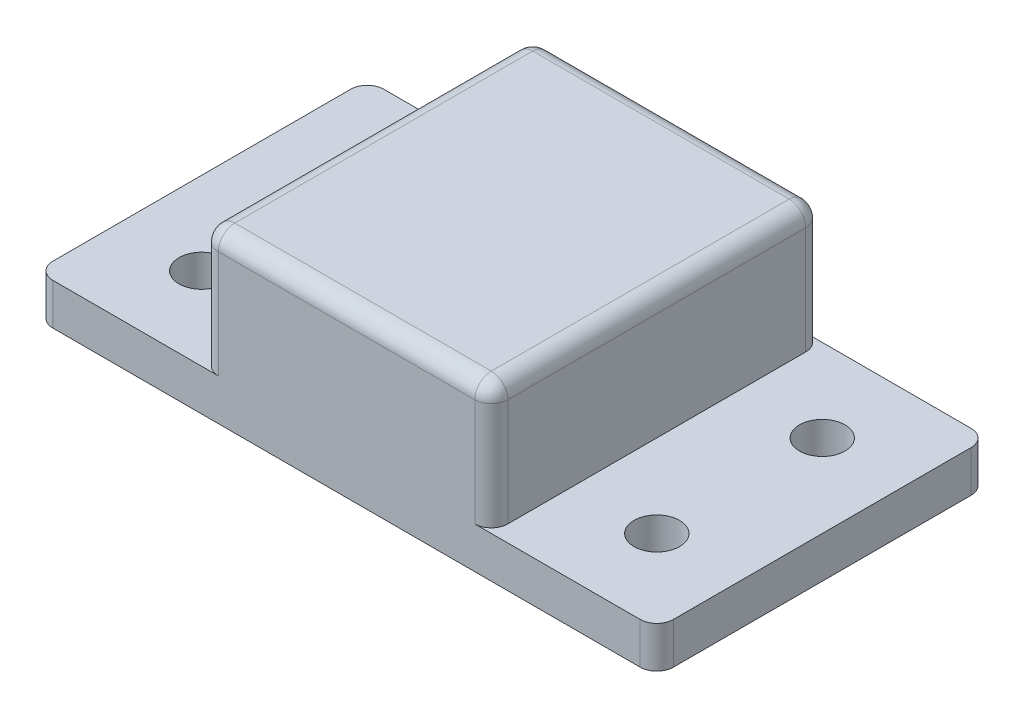
ISO-10303-21;
HEADER;
FILE_DESCRIPTION(('STEP AP214'),'2;1');
FILE_NAME('part.step','',(''),(''),'','','');
FILE_SCHEMA(('AUTOMOTIVE_DESIGN { 1 0 10303 214 1 1 1 1 }'));
ENDSEC;
DATA;
#1=APPLICATION_CONTEXT('core data for automotive mechanical design processes');
#2=APPLICATION_PROTOCOL_DEFINITION('international standard','automotive_design',2000,#1);
#3=PRODUCT_CONTEXT('',#1,'mechanical');
#4=PRODUCT('Part','Part','',(#3));
#5=PRODUCT_RELATED_PRODUCT_CATEGORY('part','',(#4));
#6=PRODUCT_DEFINITION_FORMATION('','',#4);
#7=PRODUCT_DEFINITION_CONTEXT('part definition',#1,'design');
#8=PRODUCT_DEFINITION('design','',#6,#7);
#9=PRODUCT_DEFINITION_SHAPE('','',#8);
#10=(LENGTH_UNIT() NAMED_UNIT(*) SI_UNIT(.MILLI.,.METRE.));
#11=(NAMED_UNIT(*) PLANE_ANGLE_UNIT() SI_UNIT($,.RADIAN.));
#12=(NAMED_UNIT(*) SI_UNIT($,.STERADIAN.) SOLID_ANGLE_UNIT());
#13=UNCERTAINTY_MEASURE_WITH_UNIT(LENGTH_MEASURE(1.E-05),#10,'distance_accuracy_value','');
#14=(GEOMETRIC_REPRESENTATION_CONTEXT(3) GLOBAL_UNCERTAINTY_ASSIGNED_CONTEXT((#13)) GLOBAL_UNIT_ASSIGNED_CONTEXT((#10,
#11,#12)) REPRESENTATION_CONTEXT('',''));
#15=CARTESIAN_POINT('',(0.,0.,0.));
#16=DIRECTION('',(0.,0.,1.));
#17=DIRECTION('',(1.,0.,0.));
#18=AXIS2_PLACEMENT_3D('',#15,#16,#17);
#19=CARTESIAN_POINT('',(0.,5.,0.));
#20=DIRECTION('',(0.,-1.,0.));
#21=DIRECTION('',(0.,0.,-1.));
#22=AXIS2_PLACEMENT_3D('',#19,#20,#21);
#23=PLANE('',#22);
#24=CARTESIAN_POINT('',(27.5,5.,10.));
#25=DIRECTION('',(0.,-1.,0.));
#26=DIRECTION('',(0.,0.,-1.));
#27=AXIS2_PLACEMENT_3D('',#24,#25,#26);
#28=CIRCLE('',#27,2.75);
#29=CARTESIAN_POINT('',(27.5,5.,7.25));
#30=VERTEX_POINT('',#29);
#31=EDGE_CURVE('E43',#30,#30,#28,.T.);
#32=ORIENTED_EDGE('',*,*,#31,.T.);
#33=EDGE_LOOP('',(#32));
#34=FACE_BOUND('',#33,.T.);
#35=CARTESIAN_POINT('',(27.5,5.,-10.));
#36=DIRECTION('',(0.,-1.,0.));
#37=DIRECTION('',(0.,0.,-1.));
#38=AXIS2_PLACEMENT_3D('',#35,#36,#37);
#39=CIRCLE('',#38,2.75);
#40=CARTESIAN_POINT('',(27.5,5.,-12.75));
#41=VERTEX_POINT('',#40);
#42=EDGE_CURVE('E381',#41,#41,#39,.T.);
#43=ORIENTED_EDGE('',*,*,#42,.T.);
#44=EDGE_LOOP('',(#43));
#45=FACE_BOUND('',#44,.T.);
#46=DIRECTION('',(1.,0.,0.));
#47=VECTOR('',#46,1.);
#48=CARTESIAN_POINT('',(-37.5,5.,20.));
#49=LINE('',#48,#47);
#50=CARTESIAN_POINT('',(15.5,5.,20.));
#51=VERTEX_POINT('',#50);
#52=CARTESIAN_POINT('',(35.5,5.,20.));
#53=VERTEX_POINT('',#52);
#54=EDGE_CURVE('E420',#51,#53,#49,.T.);
#55=ORIENTED_EDGE('',*,*,#54,.T.);
#56=CARTESIAN_POINT('',(35.5,5.,18.));
#57=DIRECTION('',(0.,-1.,0.));
#58=DIRECTION('',(0.,0.,-1.));
#59=AXIS2_PLACEMENT_3D('',#56,#57,#58);
#60=CIRCLE('',#59,2.);
#61=CARTESIAN_POINT('',(37.5,5.,18.));
#62=VERTEX_POINT('',#61);
#63=EDGE_CURVE('E245',#53,#62,#60,.F.);
#64=ORIENTED_EDGE('',*,*,#63,.T.);
#65=DIRECTION('',(0.,0.,1.));
#66=VECTOR('',#65,1.);
#67=CARTESIAN_POINT('',(37.5,5.,-20.));
#68=LINE('',#67,#66);
#69=CARTESIAN_POINT('',(37.5,5.,-18.));
#70=VERTEX_POINT('',#69);
#71=EDGE_CURVE('E417',#70,#62,#68,.T.);
#72=ORIENTED_EDGE('',*,*,#71,.F.);
#73=CARTESIAN_POINT('',(35.5,5.,-18.));
#74=DIRECTION('',(0.,-1.,0.));
#75=DIRECTION('',(0.,0.,-1.));
#76=AXIS2_PLACEMENT_3D('',#73,#74,#75);
#77=CIRCLE('',#76,2.);
#78=CARTESIAN_POINT('',(35.5,5.,-20.));
#79=VERTEX_POINT('',#78);
#80=EDGE_CURVE('E220',#70,#79,#77,.F.);
#81=ORIENTED_EDGE('',*,*,#80,.T.);
#82=DIRECTION('',(1.,0.,0.));
#83=VECTOR('',#82,1.);
#84=CARTESIAN_POINT('',(-37.5,5.,-20.));
#85=LINE('',#84,#83);
#86=CARTESIAN_POINT('',(15.5,5.,-20.));
#87=VERTEX_POINT('',#86);
#88=EDGE_CURVE('E418',#87,#79,#85,.T.);
#89=ORIENTED_EDGE('',*,*,#88,.F.);
#90=CARTESIAN_POINT('',(15.5,5.,-18.));
#91=DIRECTION('',(0.,-1.,0.));
#92=DIRECTION('',(0.,0.,-1.));
#93=AXIS2_PLACEMENT_3D('',#90,#91,#92);
#94=CIRCLE('',#93,2.);
#95=CARTESIAN_POINT('',(17.5,5.,-18.));
#96=VERTEX_POINT('',#95);
#97=EDGE_CURVE('E315',#87,#96,#94,.T.);
#98=ORIENTED_EDGE('',*,*,#97,.T.);
#99=DIRECTION('',(0.,0.,-1.));
#100=VECTOR('',#99,1.);
#101=CARTESIAN_POINT('',(17.5,5.,-20.));
#102=LINE('',#101,#100);
#103=CARTESIAN_POINT('',(17.5,5.,18.));
#104=VERTEX_POINT('',#103);
#105=EDGE_CURVE('E371',#104,#96,#102,.T.);
#106=ORIENTED_EDGE('',*,*,#105,.F.);
#107=CARTESIAN_POINT('',(15.5,5.,18.));
#108=DIRECTION('',(0.,-1.,0.));
#109=DIRECTION('',(0.,0.,-1.));
#110=AXIS2_PLACEMENT_3D('',#107,#108,#109);
#111=CIRCLE('',#110,2.);
#112=EDGE_CURVE('E11',#104,#51,#111,.T.);
#113=ORIENTED_EDGE('',*,*,#112,.T.);
#114=EDGE_LOOP('',(#55,#64,#72,#81,#89,#98,#106,#113));
#115=FACE_BOUND('',#114,.T.);
#116=ADVANCED_FACE('F39',(#34,#45,#115),#23,.F.);
#117=CARTESIAN_POINT('',(-27.5,5.,10.));
#118=DIRECTION('',(0.,-1.,0.));
#119=DIRECTION('',(0.,0.,-1.));
#120=AXIS2_PLACEMENT_3D('',#117,#118,#119);
#121=CIRCLE('',#120,2.75);
#122=CARTESIAN_POINT('',(-27.5,5.,7.25));
#123=VERTEX_POINT('',#122);
#124=EDGE_CURVE('E376',#123,#123,#121,.T.);
#125=ORIENTED_EDGE('',*,*,#124,.T.);
#126=EDGE_LOOP('',(#125));
#127=FACE_BOUND('',#126,.T.);
#128=CARTESIAN_POINT('',(-27.5,5.,-10.));
#129=DIRECTION('',(0.,-1.,0.));
#130=DIRECTION('',(0.,0.,-1.));
#131=AXIS2_PLACEMENT_3D('',#128,#129,#130);
#132=CIRCLE('',#131,2.75);
#133=CARTESIAN_POINT('',(-27.5,5.,-12.75));
#134=VERTEX_POINT('',#133);
#135=EDGE_CURVE('E328',#134,#134,#132,.T.);
#136=ORIENTED_EDGE('',*,*,#135,.T.);
#137=EDGE_LOOP('',(#136));
#138=FACE_BOUND('',#137,.T.);
#139=DIRECTION('',(0.,0.,1.));
#140=VECTOR('',#139,1.);
#141=CARTESIAN_POINT('',(-37.5,5.,-20.));
#142=LINE('',#141,#140);
#143=CARTESIAN_POINT('',(-37.5,5.,-18.));
#144=VERTEX_POINT('',#143);
#145=CARTESIAN_POINT('',(-37.5,5.,18.));
#146=VERTEX_POINT('',#145);
#147=EDGE_CURVE('E221',#144,#146,#142,.T.);
#148=ORIENTED_EDGE('',*,*,#147,.T.);
#149=CARTESIAN_POINT('',(-35.5,5.,18.));
#150=DIRECTION('',(0.,-1.,0.));
#151=DIRECTION('',(0.,0.,-1.));
#152=AXIS2_PLACEMENT_3D('',#149,#150,#151);
#153=CIRCLE('',#152,2.);
#154=CARTESIAN_POINT('',(-35.5,5.,20.));
#155=VERTEX_POINT('',#154);
#156=EDGE_CURVE('E262',#146,#155,#153,.F.);
#157=ORIENTED_EDGE('',*,*,#156,.T.);
#158=CARTESIAN_POINT('',(-15.5,5.,20.));
#159=VERTEX_POINT('',#158);
#160=EDGE_CURVE('E227',#155,#159,#49,.T.);
#161=ORIENTED_EDGE('',*,*,#160,.T.);
#162=CARTESIAN_POINT('',(-15.5,5.,18.));
#163=DIRECTION('',(0.,-1.,0.));
#164=DIRECTION('',(0.,0.,-1.));
#165=AXIS2_PLACEMENT_3D('',#162,#163,#164);
#166=CIRCLE('',#165,2.);
#167=CARTESIAN_POINT('',(-17.5,5.,18.));
#168=VERTEX_POINT('',#167);
#169=EDGE_CURVE('E49',#159,#168,#166,.T.);
#170=ORIENTED_EDGE('',*,*,#169,.T.);
#171=DIRECTION('',(0.,0.,1.));
#172=VECTOR('',#171,1.);
#173=CARTESIAN_POINT('',(-17.5,5.,-20.));
#174=LINE('',#173,#172);
#175=CARTESIAN_POINT('',(-17.5,5.,-18.));
#176=VERTEX_POINT('',#175);
#177=EDGE_CURVE('E410',#176,#168,#174,.T.);
#178=ORIENTED_EDGE('',*,*,#177,.F.);
#179=CARTESIAN_POINT('',(-15.5,5.,-18.));
#180=DIRECTION('',(0.,-1.,0.));
#181=DIRECTION('',(0.,0.,-1.));
#182=AXIS2_PLACEMENT_3D('',#179,#180,#181);
#183=CIRCLE('',#182,2.);
#184=CARTESIAN_POINT('',(-15.5,5.,-20.));
#185=VERTEX_POINT('',#184);
#186=EDGE_CURVE('E318',#176,#185,#183,.T.);
#187=ORIENTED_EDGE('',*,*,#186,.T.);
#188=CARTESIAN_POINT('',(-35.5,5.,-20.));
#189=VERTEX_POINT('',#188);
#190=EDGE_CURVE('E414',#189,#185,#85,.T.);
#191=ORIENTED_EDGE('',*,*,#190,.F.);
#192=CARTESIAN_POINT('',(-35.5,5.,-18.));
#193=DIRECTION('',(0.,-1.,0.));
#194=DIRECTION('',(0.,0.,-1.));
#195=AXIS2_PLACEMENT_3D('',#192,#193,#194);
#196=CIRCLE('',#195,2.);
#197=EDGE_CURVE('E259',#189,#144,#196,.F.);
#198=ORIENTED_EDGE('',*,*,#197,.T.);
#199=EDGE_LOOP('',(#148,#157,#161,#170,#178,#187,#191,#198));
#200=FACE_BOUND('',#199,.T.);
#201=ADVANCED_FACE('F456',(#127,#138,#200),#23,.F.);
#202=CARTESIAN_POINT('',(-37.5,5.,-20.));
#203=DIRECTION('',(0.,0.,-1.));
#204=DIRECTION('',(-1.,0.,0.));
#205=AXIS2_PLACEMENT_3D('',#202,#203,#204);
#206=PLANE('',#205);
#207=DIRECTION('',(0.,-1.,0.));
#208=VECTOR('',#207,1.);
#209=CARTESIAN_POINT('',(15.5,5.,-20.));
#210=LINE('',#209,#208);
#211=CARTESIAN_POINT('',(15.5,18.,-20.));
#212=VERTEX_POINT('',#211);
#213=EDGE_CURVE('E304',#212,#87,#210,.T.);
#214=ORIENTED_EDGE('',*,*,#213,.T.);
#215=ORIENTED_EDGE('',*,*,#88,.T.);
#216=DIRECTION('',(0.,-1.,0.));
#217=VECTOR('',#216,1.);
#218=CARTESIAN_POINT('',(35.5,5.,-20.));
#219=LINE('',#218,#217);
#220=CARTESIAN_POINT('',(35.5,0.,-20.));
#221=VERTEX_POINT('',#220);
#222=EDGE_CURVE('E250',#79,#221,#219,.T.);
#223=ORIENTED_EDGE('',*,*,#222,.T.);
#224=DIRECTION('',(1.,0.,0.));
#225=VECTOR('',#224,1.);
#226=CARTESIAN_POINT('',(-37.5,0.,-20.));
#227=LINE('',#226,#225);
#228=CARTESIAN_POINT('',(-35.5,0.,-20.));
#229=VERTEX_POINT('',#228);
#230=EDGE_CURVE('E200',#229,#221,#227,.T.);
#231=ORIENTED_EDGE('',*,*,#230,.F.);
#232=DIRECTION('',(0.,-1.,0.));
#233=VECTOR('',#232,1.);
#234=CARTESIAN_POINT('',(-35.5,5.,-20.));
#235=LINE('',#234,#233);
#236=EDGE_CURVE('E247',#229,#189,#235,.F.);
#237=ORIENTED_EDGE('',*,*,#236,.T.);
#238=ORIENTED_EDGE('',*,*,#190,.T.);
#239=DIRECTION('',(0.,-1.,0.));
#240=VECTOR('',#239,1.);
#241=CARTESIAN_POINT('',(-15.5,20.,-20.));
#242=LINE('',#241,#240);
#243=CARTESIAN_POINT('',(-15.5,18.,-20.));
#244=VERTEX_POINT('',#243);
#245=EDGE_CURVE('E298',#185,#244,#242,.F.);
#246=ORIENTED_EDGE('',*,*,#245,.T.);
#247=DIRECTION('',(-1.,0.,0.));
#248=VECTOR('',#247,1.);
#249=CARTESIAN_POINT('',(-37.5,18.,-20.));
#250=LINE('',#249,#248);
#251=EDGE_CURVE('E301',#244,#212,#250,.F.);
#252=ORIENTED_EDGE('',*,*,#251,.T.);
#253=EDGE_LOOP('',(#214,#215,#223,#231,#237,#238,#246,#252));
#254=FACE_BOUND('',#253,.T.);
#255=ADVANCED_FACE('F438',(#254),#206,.T.);
#256=CARTESIAN_POINT('',(-37.5,5.,-20.));
#257=DIRECTION('',(1.,0.,0.));
#258=DIRECTION('',(0.,0.,-1.));
#259=AXIS2_PLACEMENT_3D('',#256,#257,#258);
#260=PLANE('',#259);
#261=DIRECTION('',(0.,0.,1.));
#262=VECTOR('',#261,1.);
#263=CARTESIAN_POINT('',(-37.5,0.,-20.));
#264=LINE('',#263,#262);
#265=CARTESIAN_POINT('',(-37.5,0.,-18.));
#266=VERTEX_POINT('',#265);
#267=CARTESIAN_POINT('',(-37.5,0.,18.));
#268=VERTEX_POINT('',#267);
#269=EDGE_CURVE('E230',#266,#268,#264,.T.);
#270=ORIENTED_EDGE('',*,*,#269,.T.);
#271=DIRECTION('',(0.,-1.,0.));
#272=VECTOR('',#271,1.);
#273=CARTESIAN_POINT('',(-37.5,5.,18.));
#274=LINE('',#273,#272);
#275=EDGE_CURVE('E256',#268,#146,#274,.F.);
#276=ORIENTED_EDGE('',*,*,#275,.T.);
#277=ORIENTED_EDGE('',*,*,#147,.F.);
#278=DIRECTION('',(0.,-1.,0.));
#279=VECTOR('',#278,1.);
#280=CARTESIAN_POINT('',(-37.5,0.,-18.));
#281=LINE('',#280,#279);
#282=EDGE_CURVE('E252',#144,#266,#281,.T.);
#283=ORIENTED_EDGE('',*,*,#282,.T.);
#284=EDGE_LOOP('',(#270,#276,#277,#283));
#285=FACE_BOUND('',#284,.T.);
#286=ADVANCED_FACE('F462',(#285),#260,.F.);
#287=CARTESIAN_POINT('',(-37.5,5.,20.));
#288=DIRECTION('',(0.,0.,-1.));
#289=DIRECTION('',(-1.,0.,0.));
#290=AXIS2_PLACEMENT_3D('',#287,#288,#289);
#291=PLANE('',#290);
#292=DIRECTION('',(0.,-1.,0.));
#293=VECTOR('',#292,1.);
#294=CARTESIAN_POINT('',(-15.5,5.,20.));
#295=LINE('',#294,#293);
#296=CARTESIAN_POINT('',(-15.5,18.,20.));
#297=VERTEX_POINT('',#296);
#298=EDGE_CURVE('E285',#297,#159,#295,.T.);
#299=ORIENTED_EDGE('',*,*,#298,.T.);
#300=ORIENTED_EDGE('',*,*,#160,.F.);
#301=DIRECTION('',(0.,-1.,0.));
#302=VECTOR('',#301,1.);
#303=CARTESIAN_POINT('',(-35.5,5.,20.));
#304=LINE('',#303,#302);
#305=CARTESIAN_POINT('',(-35.5,0.,20.));
#306=VERTEX_POINT('',#305);
#307=EDGE_CURVE('E238',#155,#306,#304,.T.);
#308=ORIENTED_EDGE('',*,*,#307,.T.);
#309=DIRECTION('',(1.,0.,0.));
#310=VECTOR('',#309,1.);
#311=CARTESIAN_POINT('',(-37.5,0.,20.));
#312=LINE('',#311,#310);
#313=CARTESIAN_POINT('',(35.5,0.,20.));
#314=VERTEX_POINT('',#313);
#315=EDGE_CURVE('E216',#306,#314,#312,.T.);
#316=ORIENTED_EDGE('',*,*,#315,.T.);
#317=DIRECTION('',(0.,-1.,0.));
#318=VECTOR('',#317,1.);
#319=CARTESIAN_POINT('',(35.5,5.,20.));
#320=LINE('',#319,#318);
#321=EDGE_CURVE('E242',#314,#53,#320,.F.);
#322=ORIENTED_EDGE('',*,*,#321,.T.);
#323=ORIENTED_EDGE('',*,*,#54,.F.);
#324=DIRECTION('',(0.,-1.,0.));
#325=VECTOR('',#324,1.);
#326=CARTESIAN_POINT('',(15.5,5.,20.));
#327=LINE('',#326,#325);
#328=CARTESIAN_POINT('',(15.5,18.,20.));
#329=VERTEX_POINT('',#328);
#330=EDGE_CURVE('E278',#51,#329,#327,.F.);
#331=ORIENTED_EDGE('',*,*,#330,.T.);
#332=DIRECTION('',(1.,0.,0.));
#333=VECTOR('',#332,1.);
#334=CARTESIAN_POINT('',(-17.5,18.,20.));
#335=LINE('',#334,#333);
#336=EDGE_CURVE('E281',#329,#297,#335,.F.);
#337=ORIENTED_EDGE('',*,*,#336,.T.);
#338=EDGE_LOOP('',(#299,#300,#308,#316,#322,#323,#331,#337));
#339=FACE_BOUND('',#338,.T.);
#340=ADVANCED_FACE('F452',(#339),#291,.F.);
#341=CARTESIAN_POINT('',(37.5,5.,-20.));
#342=DIRECTION('',(1.,0.,0.));
#343=DIRECTION('',(0.,0.,-1.));
#344=AXIS2_PLACEMENT_3D('',#341,#342,#343);
#345=PLANE('',#344);
#346=ORIENTED_EDGE('',*,*,#71,.T.);
#347=DIRECTION('',(0.,-1.,0.));
#348=VECTOR('',#347,1.);
#349=CARTESIAN_POINT('',(37.5,0.,18.));
#350=LINE('',#349,#348);
#351=CARTESIAN_POINT('',(37.5,0.,18.));
#352=VERTEX_POINT('',#351);
#353=EDGE_CURVE('E215',#62,#352,#350,.T.);
#354=ORIENTED_EDGE('',*,*,#353,.T.);
#355=DIRECTION('',(0.,0.,1.));
#356=VECTOR('',#355,1.);
#357=CARTESIAN_POINT('',(37.5,0.,-20.));
#358=LINE('',#357,#356);
#359=CARTESIAN_POINT('',(37.5,0.,-18.));
#360=VERTEX_POINT('',#359);
#361=EDGE_CURVE('E198',#360,#352,#358,.T.);
#362=ORIENTED_EDGE('',*,*,#361,.F.);
#363=DIRECTION('',(0.,-1.,0.));
#364=VECTOR('',#363,1.);
#365=CARTESIAN_POINT('',(37.5,5.,-18.));
#366=LINE('',#365,#364);
#367=EDGE_CURVE('E212',#360,#70,#366,.F.);
#368=ORIENTED_EDGE('',*,*,#367,.T.);
#369=EDGE_LOOP('',(#346,#354,#362,#368));
#370=FACE_BOUND('',#369,.T.);
#371=ADVANCED_FACE('F211',(#370),#345,.T.);
#372=CARTESIAN_POINT('',(0.,0.,0.));
#373=DIRECTION('',(0.,-1.,0.));
#374=DIRECTION('',(0.,0.,-1.));
#375=AXIS2_PLACEMENT_3D('',#372,#373,#374);
#376=PLANE('',#375);
#377=CARTESIAN_POINT('',(27.5,0.,10.));
#378=DIRECTION('',(0.,-1.,0.));
#379=DIRECTION('',(0.,0.,-1.));
#380=AXIS2_PLACEMENT_3D('',#377,#378,#379);
#381=CIRCLE('',#380,2.775);
#382=CARTESIAN_POINT('',(27.5,0.,7.225));
#383=VERTEX_POINT('',#382);
#384=EDGE_CURVE('E822',#383,#383,#381,.T.);
#385=ORIENTED_EDGE('',*,*,#384,.F.);
#386=EDGE_LOOP('',(#385));
#387=FACE_BOUND('',#386,.T.);
#388=CARTESIAN_POINT('',(27.5,0.,-10.));
#389=DIRECTION('',(0.,-1.,0.));
#390=DIRECTION('',(0.,0.,-1.));
#391=AXIS2_PLACEMENT_3D('',#388,#389,#390);
#392=CIRCLE('',#391,2.775);
#393=CARTESIAN_POINT('',(27.5,0.,-12.775));
#394=VERTEX_POINT('',#393);
#395=EDGE_CURVE('E391',#394,#394,#392,.T.);
#396=ORIENTED_EDGE('',*,*,#395,.F.);
#397=EDGE_LOOP('',(#396));
#398=FACE_BOUND('',#397,.T.);
#399=CARTESIAN_POINT('',(-27.5,0.,10.));
#400=DIRECTION('',(0.,-1.,0.));
#401=DIRECTION('',(0.,0.,-1.));
#402=AXIS2_PLACEMENT_3D('',#399,#400,#401);
#403=CIRCLE('',#402,2.775);
#404=CARTESIAN_POINT('',(-27.5,0.,7.225));
#405=VERTEX_POINT('',#404);
#406=EDGE_CURVE('E383',#405,#405,#403,.T.);
#407=ORIENTED_EDGE('',*,*,#406,.F.);
#408=EDGE_LOOP('',(#407));
#409=FACE_BOUND('',#408,.T.);
#410=CARTESIAN_POINT('',(-27.5,0.,-10.));
#411=DIRECTION('',(0.,-1.,0.));
#412=DIRECTION('',(0.,0.,-1.));
#413=AXIS2_PLACEMENT_3D('',#410,#411,#412);
#414=CIRCLE('',#413,2.775);
#415=CARTESIAN_POINT('',(-27.5,0.,-12.775));
#416=VERTEX_POINT('',#415);
#417=EDGE_CURVE('E379',#416,#416,#414,.T.);
#418=ORIENTED_EDGE('',*,*,#417,.F.);
#419=EDGE_LOOP('',(#418));
#420=FACE_BOUND('',#419,.T.);
#421=ORIENTED_EDGE('',*,*,#361,.T.);
#422=CARTESIAN_POINT('',(35.5,0.,18.));
#423=DIRECTION('',(0.,-1.,0.));
#424=DIRECTION('',(0.,0.,-1.));
#425=AXIS2_PLACEMENT_3D('',#422,#423,#424);
#426=CIRCLE('',#425,2.);
#427=EDGE_CURVE('E205',#352,#314,#426,.T.);
#428=ORIENTED_EDGE('',*,*,#427,.T.);
#429=ORIENTED_EDGE('',*,*,#315,.F.);
#430=CARTESIAN_POINT('',(-35.5,0.,18.));
#431=DIRECTION('',(0.,-1.,0.));
#432=DIRECTION('',(0.,0.,-1.));
#433=AXIS2_PLACEMENT_3D('',#430,#431,#432);
#434=CIRCLE('',#433,2.);
#435=EDGE_CURVE('E206',#306,#268,#434,.T.);
#436=ORIENTED_EDGE('',*,*,#435,.T.);
#437=ORIENTED_EDGE('',*,*,#269,.F.);
#438=CARTESIAN_POINT('',(-35.5,0.,-18.));
#439=DIRECTION('',(0.,-1.,0.));
#440=DIRECTION('',(0.,0.,-1.));
#441=AXIS2_PLACEMENT_3D('',#438,#439,#440);
#442=CIRCLE('',#441,2.);
#443=EDGE_CURVE('E223',#266,#229,#442,.T.);
#444=ORIENTED_EDGE('',*,*,#443,.T.);
#445=ORIENTED_EDGE('',*,*,#230,.T.);
#446=CARTESIAN_POINT('',(35.5,0.,-18.));
#447=DIRECTION('',(0.,-1.,0.));
#448=DIRECTION('',(0.,0.,-1.));
#449=AXIS2_PLACEMENT_3D('',#446,#447,#448);
#450=CIRCLE('',#449,2.);
#451=EDGE_CURVE('E195',#221,#360,#450,.T.);
#452=ORIENTED_EDGE('',*,*,#451,.T.);
#453=EDGE_LOOP('',(#421,#428,#429,#436,#437,#444,#445,#452));
#454=FACE_BOUND('',#453,.T.);
#455=ADVANCED_FACE('F197',(#387,#398,#409,#420,#454),#376,.T.);
#456=CARTESIAN_POINT('',(17.5,20.,-20.));
#457=DIRECTION('',(-1.,0.,0.));
#458=DIRECTION('',(0.,0.,1.));
#459=AXIS2_PLACEMENT_3D('',#456,#457,#458);
#460=PLANE('',#459);
#461=ORIENTED_EDGE('',*,*,#105,.T.);
#462=DIRECTION('',(0.,-1.,0.));
#463=VECTOR('',#462,1.);
#464=CARTESIAN_POINT('',(17.5,20.,-18.));
#465=LINE('',#464,#463);
#466=CARTESIAN_POINT('',(17.5,18.,-18.));
#467=VERTEX_POINT('',#466);
#468=EDGE_CURVE('E60',#96,#467,#465,.F.);
#469=ORIENTED_EDGE('',*,*,#468,.T.);
#470=DIRECTION('',(0.,0.,-1.));
#471=VECTOR('',#470,1.);
#472=CARTESIAN_POINT('',(17.5,18.,20.));
#473=LINE('',#472,#471);
#474=CARTESIAN_POINT('',(17.5,18.,18.));
#475=VERTEX_POINT('',#474);
#476=EDGE_CURVE('E68',#467,#475,#473,.F.);
#477=ORIENTED_EDGE('',*,*,#476,.T.);
#478=DIRECTION('',(0.,-1.,0.));
#479=VECTOR('',#478,1.);
#480=CARTESIAN_POINT('',(17.5,20.,18.));
#481=LINE('',#480,#479);
#482=EDGE_CURVE('E308',#475,#104,#481,.T.);
#483=ORIENTED_EDGE('',*,*,#482,.T.);
#484=EDGE_LOOP('',(#461,#469,#477,#483));
#485=FACE_BOUND('',#484,.T.);
#486=ADVANCED_FACE('F502',(#485),#460,.F.);
#487=CARTESIAN_POINT('',(-17.5,20.,-20.));
#488=DIRECTION('',(1.,0.,0.));
#489=DIRECTION('',(0.,0.,-1.));
#490=AXIS2_PLACEMENT_3D('',#487,#488,#489);
#491=PLANE('',#490);
#492=DIRECTION('',(0.,0.,1.));
#493=VECTOR('',#492,1.);
#494=CARTESIAN_POINT('',(-17.5,18.,-20.));
#495=LINE('',#494,#493);
#496=CARTESIAN_POINT('',(-17.5,18.,18.));
#497=VERTEX_POINT('',#496);
#498=CARTESIAN_POINT('',(-17.5,18.,-18.));
#499=VERTEX_POINT('',#498);
#500=EDGE_CURVE('E292',#497,#499,#495,.F.);
#501=ORIENTED_EDGE('',*,*,#500,.T.);
#502=DIRECTION('',(0.,-1.,0.));
#503=VECTOR('',#502,1.);
#504=CARTESIAN_POINT('',(-17.5,5.,-18.));
#505=LINE('',#504,#503);
#506=EDGE_CURVE('E295',#499,#176,#505,.T.);
#507=ORIENTED_EDGE('',*,*,#506,.T.);
#508=ORIENTED_EDGE('',*,*,#177,.T.);
#509=DIRECTION('',(0.,-1.,0.));
#510=VECTOR('',#509,1.);
#511=CARTESIAN_POINT('',(-17.5,20.,18.));
#512=LINE('',#511,#510);
#513=EDGE_CURVE('E289',#168,#497,#512,.F.);
#514=ORIENTED_EDGE('',*,*,#513,.T.);
#515=EDGE_LOOP('',(#501,#507,#508,#514));
#516=FACE_BOUND('',#515,.T.);
#517=ADVANCED_FACE('F731',(#516),#491,.F.);
#518=CARTESIAN_POINT('',(0.,20.,0.));
#519=DIRECTION('',(0.,1.,0.));
#520=DIRECTION('',(0.,0.,1.));
#521=AXIS2_PLACEMENT_3D('',#518,#519,#520);
#522=PLANE('',#521);
#523=DIRECTION('',(0.,0.,1.));
#524=VECTOR('',#523,1.);
#525=CARTESIAN_POINT('',(-15.5,20.,20.));
#526=LINE('',#525,#524);
#527=CARTESIAN_POINT('',(-15.5,20.,-18.));
#528=VERTEX_POINT('',#527);
#529=CARTESIAN_POINT('',(-15.5,20.,18.));
#530=VERTEX_POINT('',#529);
#531=EDGE_CURVE('E271',#528,#530,#526,.T.);
#532=ORIENTED_EDGE('',*,*,#531,.T.);
#533=DIRECTION('',(1.,0.,0.));
#534=VECTOR('',#533,1.);
#535=CARTESIAN_POINT('',(17.5,20.,18.));
#536=LINE('',#535,#534);
#537=CARTESIAN_POINT('',(15.5,20.,18.));
#538=VERTEX_POINT('',#537);
#539=EDGE_CURVE('E274',#530,#538,#536,.T.);
#540=ORIENTED_EDGE('',*,*,#539,.T.);
#541=DIRECTION('',(0.,0.,-1.));
#542=VECTOR('',#541,1.);
#543=CARTESIAN_POINT('',(15.5,20.,-20.));
#544=LINE('',#543,#542);
#545=CARTESIAN_POINT('',(15.5,20.,-18.));
#546=VERTEX_POINT('',#545);
#547=EDGE_CURVE('E265',#538,#546,#544,.T.);
#548=ORIENTED_EDGE('',*,*,#547,.T.);
#549=DIRECTION('',(-1.,0.,0.));
#550=VECTOR('',#549,1.);
#551=CARTESIAN_POINT('',(0.,20.,-18.));
#552=LINE('',#551,#550);
#553=EDGE_CURVE('E268',#546,#528,#552,.T.);
#554=ORIENTED_EDGE('',*,*,#553,.T.);
#555=EDGE_LOOP('',(#532,#540,#548,#554));
#556=FACE_BOUND('',#555,.T.);
#557=ADVANCED_FACE('F517',(#556),#522,.T.);
#558=CARTESIAN_POINT('',(35.5,5.,18.));
#559=DIRECTION('',(0.,1.,0.));
#560=DIRECTION('',(0.,0.,1.));
#561=AXIS2_PLACEMENT_3D('',#558,#559,#560);
#562=CYLINDRICAL_SURFACE('',#561,2.);
#563=ORIENTED_EDGE('',*,*,#63,.F.);
#564=ORIENTED_EDGE('',*,*,#321,.F.);
#565=ORIENTED_EDGE('',*,*,#427,.F.);
#566=ORIENTED_EDGE('',*,*,#353,.F.);
#567=EDGE_LOOP('',(#563,#564,#565,#566));
#568=FACE_BOUND('',#567,.T.);
#569=ADVANCED_FACE('F446',(#568),#562,.T.);
#570=CARTESIAN_POINT('',(35.5,5.,-18.));
#571=DIRECTION('',(0.,-1.,0.));
#572=DIRECTION('',(0.,0.,-1.));
#573=AXIS2_PLACEMENT_3D('',#570,#571,#572);
#574=CYLINDRICAL_SURFACE('',#573,2.);
#575=ORIENTED_EDGE('',*,*,#80,.F.);
#576=ORIENTED_EDGE('',*,*,#367,.F.);
#577=ORIENTED_EDGE('',*,*,#451,.F.);
#578=ORIENTED_EDGE('',*,*,#222,.F.);
#579=EDGE_LOOP('',(#575,#576,#577,#578));
#580=FACE_BOUND('',#579,.T.);
#581=ADVANCED_FACE('F219',(#580),#574,.T.);
#582=CARTESIAN_POINT('',(-35.5,5.,18.));
#583=DIRECTION('',(0.,-1.,0.));
#584=DIRECTION('',(0.,0.,-1.));
#585=AXIS2_PLACEMENT_3D('',#582,#583,#584);
#586=CYLINDRICAL_SURFACE('',#585,2.);
#587=ORIENTED_EDGE('',*,*,#156,.F.);
#588=ORIENTED_EDGE('',*,*,#275,.F.);
#589=ORIENTED_EDGE('',*,*,#435,.F.);
#590=ORIENTED_EDGE('',*,*,#307,.F.);
#591=EDGE_LOOP('',(#587,#588,#589,#590));
#592=FACE_BOUND('',#591,.T.);
#593=ADVANCED_FACE('F450',(#592),#586,.T.);
#594=CARTESIAN_POINT('',(-35.5,5.,-18.));
#595=DIRECTION('',(0.,1.,0.));
#596=DIRECTION('',(0.,0.,1.));
#597=AXIS2_PLACEMENT_3D('',#594,#595,#596);
#598=CYLINDRICAL_SURFACE('',#597,2.);
#599=ORIENTED_EDGE('',*,*,#197,.F.);
#600=ORIENTED_EDGE('',*,*,#236,.F.);
#601=ORIENTED_EDGE('',*,*,#443,.F.);
#602=ORIENTED_EDGE('',*,*,#282,.F.);
#603=EDGE_LOOP('',(#599,#600,#601,#602));
#604=FACE_BOUND('',#603,.T.);
#605=ADVANCED_FACE('F464',(#604),#598,.T.);
#606=CARTESIAN_POINT('',(-15.5,20.,-18.));
#607=DIRECTION('',(0.,1.,0.));
#608=DIRECTION('',(0.,0.,1.));
#609=AXIS2_PLACEMENT_3D('',#606,#607,#608);
#610=CYLINDRICAL_SURFACE('',#609,2.);
#611=ORIENTED_EDGE('',*,*,#186,.F.);
#612=ORIENTED_EDGE('',*,*,#506,.F.);
#613=CARTESIAN_POINT('',(-15.5,18.,-18.));
#614=DIRECTION('',(0.,1.,0.));
#615=DIRECTION('',(0.,0.,1.));
#616=AXIS2_PLACEMENT_3D('',#613,#614,#615);
#617=CIRCLE('',#616,2.);
#618=EDGE_CURVE('E367',#244,#499,#617,.T.);
#619=ORIENTED_EDGE('',*,*,#618,.F.);
#620=ORIENTED_EDGE('',*,*,#245,.F.);
#621=EDGE_LOOP('',(#611,#612,#619,#620));
#622=FACE_BOUND('',#621,.T.);
#623=ADVANCED_FACE('F41',(#622),#610,.T.);
#624=CARTESIAN_POINT('',(0.,18.,-18.));
#625=DIRECTION('',(-1.,0.,0.));
#626=DIRECTION('',(0.,0.,1.));
#627=AXIS2_PLACEMENT_3D('',#624,#625,#626);
#628=CYLINDRICAL_SURFACE('',#627,2.);
#629=CARTESIAN_POINT('',(15.5,18.,-18.));
#630=DIRECTION('',(1.,0.,0.));
#631=DIRECTION('',(0.,1.,0.));
#632=AXIS2_PLACEMENT_3D('',#629,#630,#631);
#633=CIRCLE('',#632,2.);
#634=EDGE_CURVE('E359',#212,#546,#633,.T.);
#635=ORIENTED_EDGE('',*,*,#634,.F.);
#636=ORIENTED_EDGE('',*,*,#251,.F.);
#637=CARTESIAN_POINT('',(-15.5,18.,-18.));
#638=DIRECTION('',(-1.,0.,0.));
#639=DIRECTION('',(0.,0.,1.));
#640=AXIS2_PLACEMENT_3D('',#637,#638,#639);
#641=CIRCLE('',#640,2.);
#642=EDGE_CURVE('E363',#528,#244,#641,.T.);
#643=ORIENTED_EDGE('',*,*,#642,.F.);
#644=ORIENTED_EDGE('',*,*,#553,.F.);
#645=EDGE_LOOP('',(#635,#636,#643,#644));
#646=FACE_BOUND('',#645,.T.);
#647=ADVANCED_FACE('F475',(#646),#628,.T.);
#648=CARTESIAN_POINT('',(15.5,5.,-18.));
#649=DIRECTION('',(0.,1.,0.));
#650=DIRECTION('',(0.,0.,1.));
#651=AXIS2_PLACEMENT_3D('',#648,#649,#650);
#652=CYLINDRICAL_SURFACE('',#651,2.);
#653=ORIENTED_EDGE('',*,*,#97,.F.);
#654=ORIENTED_EDGE('',*,*,#213,.F.);
#655=CARTESIAN_POINT('',(15.5,18.,-18.));
#656=DIRECTION('',(0.,1.,0.));
#657=DIRECTION('',(0.,0.,1.));
#658=AXIS2_PLACEMENT_3D('',#655,#656,#657);
#659=CIRCLE('',#658,2.);
#660=EDGE_CURVE('E355',#467,#212,#659,.T.);
#661=ORIENTED_EDGE('',*,*,#660,.F.);
#662=ORIENTED_EDGE('',*,*,#468,.F.);
#663=EDGE_LOOP('',(#653,#654,#661,#662));
#664=FACE_BOUND('',#663,.T.);
#665=ADVANCED_FACE('F482',(#664),#652,.T.);
#666=CARTESIAN_POINT('',(-15.5,18.,-18.));
#667=DIRECTION('',(0.,0.,-1.));
#668=DIRECTION('',(-1.,0.,0.));
#669=AXIS2_PLACEMENT_3D('',#666,#667,#668);
#670=SPHERICAL_SURFACE('',#669,2.);
#671=ORIENTED_EDGE('',*,*,#642,.T.);
#672=ORIENTED_EDGE('',*,*,#618,.T.);
#673=CARTESIAN_POINT('',(-15.5,18.,-18.));
#674=DIRECTION('',(0.,0.,-1.));
#675=DIRECTION('',(-1.,0.,0.));
#676=AXIS2_PLACEMENT_3D('',#673,#674,#675);
#677=CIRCLE('',#676,2.);
#678=EDGE_CURVE('E351',#528,#499,#677,.F.);
#679=ORIENTED_EDGE('',*,*,#678,.F.);
#680=EDGE_LOOP('',(#671,#672,#679));
#681=FACE_BOUND('',#680,.T.);
#682=ADVANCED_FACE('F484',(#681),#670,.T.);
#683=CARTESIAN_POINT('',(15.5,18.,-18.));
#684=DIRECTION('',(0.,0.,-1.));
#685=DIRECTION('',(-1.,0.,0.));
#686=AXIS2_PLACEMENT_3D('',#683,#684,#685);
#687=SPHERICAL_SURFACE('',#686,2.);
#688=ORIENTED_EDGE('',*,*,#660,.T.);
#689=ORIENTED_EDGE('',*,*,#634,.T.);
#690=CARTESIAN_POINT('',(15.5,18.,-18.));
#691=DIRECTION('',(0.,0.,-1.));
#692=DIRECTION('',(-1.,0.,0.));
#693=AXIS2_PLACEMENT_3D('',#690,#691,#692);
#694=CIRCLE('',#693,2.);
#695=EDGE_CURVE('E347',#467,#546,#694,.F.);
#696=ORIENTED_EDGE('',*,*,#695,.F.);
#697=EDGE_LOOP('',(#688,#689,#696));
#698=FACE_BOUND('',#697,.T.);
#699=ADVANCED_FACE('F480',(#698),#687,.T.);
#700=CARTESIAN_POINT('',(-15.5,5.,18.));
#701=DIRECTION('',(0.,-1.,0.));
#702=DIRECTION('',(0.,0.,-1.));
#703=AXIS2_PLACEMENT_3D('',#700,#701,#702);
#704=CYLINDRICAL_SURFACE('',#703,2.);
#705=ORIENTED_EDGE('',*,*,#169,.F.);
#706=ORIENTED_EDGE('',*,*,#298,.F.);
#707=CARTESIAN_POINT('',(-15.5,18.,18.));
#708=DIRECTION('',(0.,1.,0.));
#709=DIRECTION('',(0.,0.,1.));
#710=AXIS2_PLACEMENT_3D('',#707,#708,#709);
#711=CIRCLE('',#710,2.);
#712=EDGE_CURVE('E343',#497,#297,#711,.T.);
#713=ORIENTED_EDGE('',*,*,#712,.F.);
#714=ORIENTED_EDGE('',*,*,#513,.F.);
#715=EDGE_LOOP('',(#705,#706,#713,#714));
#716=FACE_BOUND('',#715,.T.);
#717=ADVANCED_FACE('F548',(#716),#704,.T.);
#718=CARTESIAN_POINT('',(-15.5,18.,0.));
#719=DIRECTION('',(0.,0.,-1.));
#720=DIRECTION('',(-1.,0.,0.));
#721=AXIS2_PLACEMENT_3D('',#718,#719,#720);
#722=CYLINDRICAL_SURFACE('',#721,2.);
#723=ORIENTED_EDGE('',*,*,#678,.T.);
#724=ORIENTED_EDGE('',*,*,#500,.F.);
#725=CARTESIAN_POINT('',(-15.5,18.,18.));
#726=DIRECTION('',(0.,0.,1.));
#727=DIRECTION('',(1.,0.,0.));
#728=AXIS2_PLACEMENT_3D('',#725,#726,#727);
#729=CIRCLE('',#728,2.);
#730=EDGE_CURVE('E339',#530,#497,#729,.T.);
#731=ORIENTED_EDGE('',*,*,#730,.F.);
#732=ORIENTED_EDGE('',*,*,#531,.F.);
#733=EDGE_LOOP('',(#723,#724,#731,#732));
#734=FACE_BOUND('',#733,.T.);
#735=ADVANCED_FACE('F544',(#734),#722,.T.);
#736=CARTESIAN_POINT('',(15.5,18.,0.));
#737=DIRECTION('',(0.,0.,1.));
#738=DIRECTION('',(1.,0.,0.));
#739=AXIS2_PLACEMENT_3D('',#736,#737,#738);
#740=CYLINDRICAL_SURFACE('',#739,2.);
#741=ORIENTED_EDGE('',*,*,#695,.T.);
#742=ORIENTED_EDGE('',*,*,#547,.F.);
#743=CARTESIAN_POINT('',(15.5,18.,18.));
#744=DIRECTION('',(0.,0.,1.));
#745=DIRECTION('',(1.,0.,0.));
#746=AXIS2_PLACEMENT_3D('',#743,#744,#745);
#747=CIRCLE('',#746,2.);
#748=EDGE_CURVE('E335',#475,#538,#747,.T.);
#749=ORIENTED_EDGE('',*,*,#748,.F.);
#750=ORIENTED_EDGE('',*,*,#476,.F.);
#751=EDGE_LOOP('',(#741,#742,#749,#750));
#752=FACE_BOUND('',#751,.T.);
#753=ADVANCED_FACE('F540',(#752),#740,.T.);
#754=CARTESIAN_POINT('',(15.5,20.,18.));
#755=DIRECTION('',(0.,-1.,0.));
#756=DIRECTION('',(0.,0.,-1.));
#757=AXIS2_PLACEMENT_3D('',#754,#755,#756);
#758=CYLINDRICAL_SURFACE('',#757,2.);
#759=ORIENTED_EDGE('',*,*,#112,.F.);
#760=ORIENTED_EDGE('',*,*,#482,.F.);
#761=CARTESIAN_POINT('',(15.5,18.,18.));
#762=DIRECTION('',(0.,1.,0.));
#763=DIRECTION('',(0.,0.,1.));
#764=AXIS2_PLACEMENT_3D('',#761,#762,#763);
#765=CIRCLE('',#764,2.);
#766=EDGE_CURVE('E331',#329,#475,#765,.T.);
#767=ORIENTED_EDGE('',*,*,#766,.F.);
#768=ORIENTED_EDGE('',*,*,#330,.F.);
#769=EDGE_LOOP('',(#759,#760,#767,#768));
#770=FACE_BOUND('',#769,.T.);
#771=ADVANCED_FACE('F536',(#770),#758,.T.);
#772=CARTESIAN_POINT('',(-15.5,18.,18.));
#773=DIRECTION('',(-1.,0.,0.));
#774=DIRECTION('',(0.,0.,1.));
#775=AXIS2_PLACEMENT_3D('',#772,#773,#774);
#776=SPHERICAL_SURFACE('',#775,2.);
#777=ORIENTED_EDGE('',*,*,#730,.T.);
#778=ORIENTED_EDGE('',*,*,#712,.T.);
#779=CARTESIAN_POINT('',(-15.5,18.,18.));
#780=DIRECTION('',(-1.,0.,0.));
#781=DIRECTION('',(0.,-1.,0.));
#782=AXIS2_PLACEMENT_3D('',#779,#780,#781);
#783=CIRCLE('',#782,2.);
#784=EDGE_CURVE('E327',#530,#297,#783,.F.);
#785=ORIENTED_EDGE('',*,*,#784,.F.);
#786=EDGE_LOOP('',(#777,#778,#785));
#787=FACE_BOUND('',#786,.T.);
#788=ADVANCED_FACE('F532',(#787),#776,.T.);
#789=CARTESIAN_POINT('',(15.5,18.,18.));
#790=DIRECTION('',(1.,0.,0.));
#791=DIRECTION('',(0.,0.,-1.));
#792=AXIS2_PLACEMENT_3D('',#789,#790,#791);
#793=SPHERICAL_SURFACE('',#792,2.);
#794=ORIENTED_EDGE('',*,*,#766,.T.);
#795=ORIENTED_EDGE('',*,*,#748,.T.);
#796=CARTESIAN_POINT('',(15.5,18.,18.));
#797=DIRECTION('',(1.,0.,0.));
#798=DIRECTION('',(0.,0.,-1.));
#799=AXIS2_PLACEMENT_3D('',#796,#797,#798);
#800=CIRCLE('',#799,2.);
#801=EDGE_CURVE('E324',#329,#538,#800,.F.);
#802=ORIENTED_EDGE('',*,*,#801,.F.);
#803=EDGE_LOOP('',(#794,#795,#802));
#804=FACE_BOUND('',#803,.T.);
#805=ADVANCED_FACE('F528',(#804),#793,.T.);
#806=CARTESIAN_POINT('',(0.,18.,18.));
#807=DIRECTION('',(-1.,0.,0.));
#808=DIRECTION('',(0.,0.,1.));
#809=AXIS2_PLACEMENT_3D('',#806,#807,#808);
#810=CYLINDRICAL_SURFACE('',#809,2.);
#811=ORIENTED_EDGE('',*,*,#784,.T.);
#812=ORIENTED_EDGE('',*,*,#336,.F.);
#813=ORIENTED_EDGE('',*,*,#801,.T.);
#814=ORIENTED_EDGE('',*,*,#539,.F.);
#815=EDGE_LOOP('',(#811,#812,#813,#814));
#816=FACE_BOUND('',#815,.T.);
#817=ADVANCED_FACE('F524',(#816),#810,.T.);
#818=CARTESIAN_POINT('',(-27.5,0.,-10.));
#819=DIRECTION('',(0.,-1.,0.));
#820=DIRECTION('',(0.,0.,-1.));
#821=AXIS2_PLACEMENT_3D('',#818,#819,#820);
#822=CYLINDRICAL_SURFACE('',#821,2.75);
#823=CARTESIAN_POINT('',(-27.5,0.0249999999999994,-10.));
#824=DIRECTION('',(0.,-1.,0.));
#825=DIRECTION('',(0.,0.,-1.));
#826=AXIS2_PLACEMENT_3D('',#823,#824,#825);
#827=CIRCLE('',#826,2.75);
#828=CARTESIAN_POINT('',(-27.5,0.0249999999999994,-12.75));
#829=VERTEX_POINT('',#828);
#830=EDGE_CURVE('E375',#829,#829,#827,.T.);
#831=ORIENTED_EDGE('',*,*,#830,.T.);
#832=EDGE_LOOP('',(#831));
#833=FACE_BOUND('',#832,.T.);
#834=ORIENTED_EDGE('',*,*,#135,.F.);
#835=EDGE_LOOP('',(#834));
#836=FACE_BOUND('',#835,.T.);
#837=ADVANCED_FACE('F527',(#833,#836),#822,.F.);
#838=CARTESIAN_POINT('',(-27.5,0.,-10.));
#839=DIRECTION('',(0.,-1.,0.));
#840=DIRECTION('',(0.,0.,-1.));
#841=AXIS2_PLACEMENT_3D('',#838,#839,#840);
#842=CONICAL_SURFACE('',#841,2.775,0.785398163397441);
#843=ORIENTED_EDGE('',*,*,#830,.F.);
#844=EDGE_LOOP('',(#843));
#845=FACE_BOUND('',#844,.T.);
#846=ORIENTED_EDGE('',*,*,#417,.T.);
#847=EDGE_LOOP('',(#846));
#848=FACE_BOUND('',#847,.T.);
#849=ADVANCED_FACE('F593',(#845,#848),#842,.F.);
#850=CARTESIAN_POINT('',(-27.5,0.,10.));
#851=DIRECTION('',(0.,-1.,0.));
#852=DIRECTION('',(0.,0.,-1.));
#853=AXIS2_PLACEMENT_3D('',#850,#851,#852);
#854=CYLINDRICAL_SURFACE('',#853,2.75);
#855=CARTESIAN_POINT('',(-27.5,0.0249999999999994,10.));
#856=DIRECTION('',(0.,-1.,0.));
#857=DIRECTION('',(0.,0.,-1.));
#858=AXIS2_PLACEMENT_3D('',#855,#856,#857);
#859=CIRCLE('',#858,2.75);
#860=CARTESIAN_POINT('',(-27.5,0.0249999999999994,7.25));
#861=VERTEX_POINT('',#860);
#862=EDGE_CURVE('E380',#861,#861,#859,.T.);
#863=ORIENTED_EDGE('',*,*,#862,.T.);
#864=EDGE_LOOP('',(#863));
#865=FACE_BOUND('',#864,.T.);
#866=ORIENTED_EDGE('',*,*,#124,.F.);
#867=EDGE_LOOP('',(#866));
#868=FACE_BOUND('',#867,.T.);
#869=ADVANCED_FACE('F601',(#865,#868),#854,.F.);
#870=CARTESIAN_POINT('',(-27.5,0.,10.));
#871=DIRECTION('',(0.,-1.,0.));
#872=DIRECTION('',(0.,0.,-1.));
#873=AXIS2_PLACEMENT_3D('',#870,#871,#872);
#874=CONICAL_SURFACE('',#873,2.775,0.785398163397441);
#875=ORIENTED_EDGE('',*,*,#862,.F.);
#876=EDGE_LOOP('',(#875));
#877=FACE_BOUND('',#876,.T.);
#878=ORIENTED_EDGE('',*,*,#406,.T.);
#879=EDGE_LOOP('',(#878));
#880=FACE_BOUND('',#879,.T.);
#881=ADVANCED_FACE('F609',(#877,#880),#874,.F.);
#882=CARTESIAN_POINT('',(27.5,0.,-10.));
#883=DIRECTION('',(0.,-1.,0.));
#884=DIRECTION('',(0.,0.,-1.));
#885=AXIS2_PLACEMENT_3D('',#882,#883,#884);
#886=CYLINDRICAL_SURFACE('',#885,2.75);
#887=CARTESIAN_POINT('',(27.5,0.0249999999999994,-10.));
#888=DIRECTION('',(0.,-1.,0.));
#889=DIRECTION('',(0.,0.,-1.));
#890=AXIS2_PLACEMENT_3D('',#887,#888,#889);
#891=CIRCLE('',#890,2.75);
#892=CARTESIAN_POINT('',(27.5,0.0249999999999994,-12.75));
#893=VERTEX_POINT('',#892);
#894=EDGE_CURVE('E384',#893,#893,#891,.T.);
#895=ORIENTED_EDGE('',*,*,#894,.T.);
#896=EDGE_LOOP('',(#895));
#897=FACE_BOUND('',#896,.T.);
#898=ORIENTED_EDGE('',*,*,#42,.F.);
#899=EDGE_LOOP('',(#898));
#900=FACE_BOUND('',#899,.T.);
#901=ADVANCED_FACE('F617',(#897,#900),#886,.F.);
#902=CARTESIAN_POINT('',(27.5,0.,-10.));
#903=DIRECTION('',(0.,-1.,0.));
#904=DIRECTION('',(0.,0.,-1.));
#905=AXIS2_PLACEMENT_3D('',#902,#903,#904);
#906=CONICAL_SURFACE('',#905,2.775,0.785398163397441);
#907=ORIENTED_EDGE('',*,*,#894,.F.);
#908=EDGE_LOOP('',(#907));
#909=FACE_BOUND('',#908,.T.);
#910=ORIENTED_EDGE('',*,*,#395,.T.);
#911=EDGE_LOOP('',(#910));
#912=FACE_BOUND('',#911,.T.);
#913=ADVANCED_FACE('F625',(#909,#912),#906,.F.);
#914=CARTESIAN_POINT('',(27.5,0.,10.));
#915=DIRECTION('',(0.,-1.,0.));
#916=DIRECTION('',(0.,0.,-1.));
#917=AXIS2_PLACEMENT_3D('',#914,#915,#916);
#918=CYLINDRICAL_SURFACE('',#917,2.75);
#919=CARTESIAN_POINT('',(27.5,0.0249999999999994,10.));
#920=DIRECTION('',(0.,-1.,0.));
#921=DIRECTION('',(0.,0.,-1.));
#922=AXIS2_PLACEMENT_3D('',#919,#920,#921);
#923=CIRCLE('',#922,2.75);
#924=CARTESIAN_POINT('',(27.5,0.0249999999999994,7.25));
#925=VERTEX_POINT('',#924);
#926=EDGE_CURVE('E819',#925,#925,#923,.T.);
#927=ORIENTED_EDGE('',*,*,#926,.T.);
#928=EDGE_LOOP('',(#927));
#929=FACE_BOUND('',#928,.T.);
#930=ORIENTED_EDGE('',*,*,#31,.F.);
#931=EDGE_LOOP('',(#930));
#932=FACE_BOUND('',#931,.T.);
#933=ADVANCED_FACE('F633',(#929,#932),#918,.F.);
#934=CARTESIAN_POINT('',(27.5,0.,10.));
#935=DIRECTION('',(0.,-1.,0.));
#936=DIRECTION('',(0.,0.,-1.));
#937=AXIS2_PLACEMENT_3D('',#934,#935,#936);
#938=CONICAL_SURFACE('',#937,2.775,0.785398163397441);
#939=ORIENTED_EDGE('',*,*,#926,.F.);
#940=EDGE_LOOP('',(#939));
#941=FACE_BOUND('',#940,.T.);
#942=ORIENTED_EDGE('',*,*,#384,.T.);
#943=EDGE_LOOP('',(#942));
#944=FACE_BOUND('',#943,.T.);
#945=ADVANCED_FACE('F641',(#941,#944),#938,.F.);
#946=CLOSED_SHELL('',(#116,#201,#255,#286,#340,#371,#455,#486,#517,#557,#569,#581,#593,#605,
#623,#647,#665,#682,#699,#717,#735,#753,#771,#788,#805,#817,#837,#849,#869,#881,#901,#913,#933,#945));
#947=MANIFOLD_SOLID_BREP('B2',#946);
#948=ADVANCED_BREP_SHAPE_REPRESENTATION('',(#18,#947),#14);
#949=SHAPE_DEFINITION_REPRESENTATION(#9,#948);
ENDSEC;
END-ISO-10303-21;
